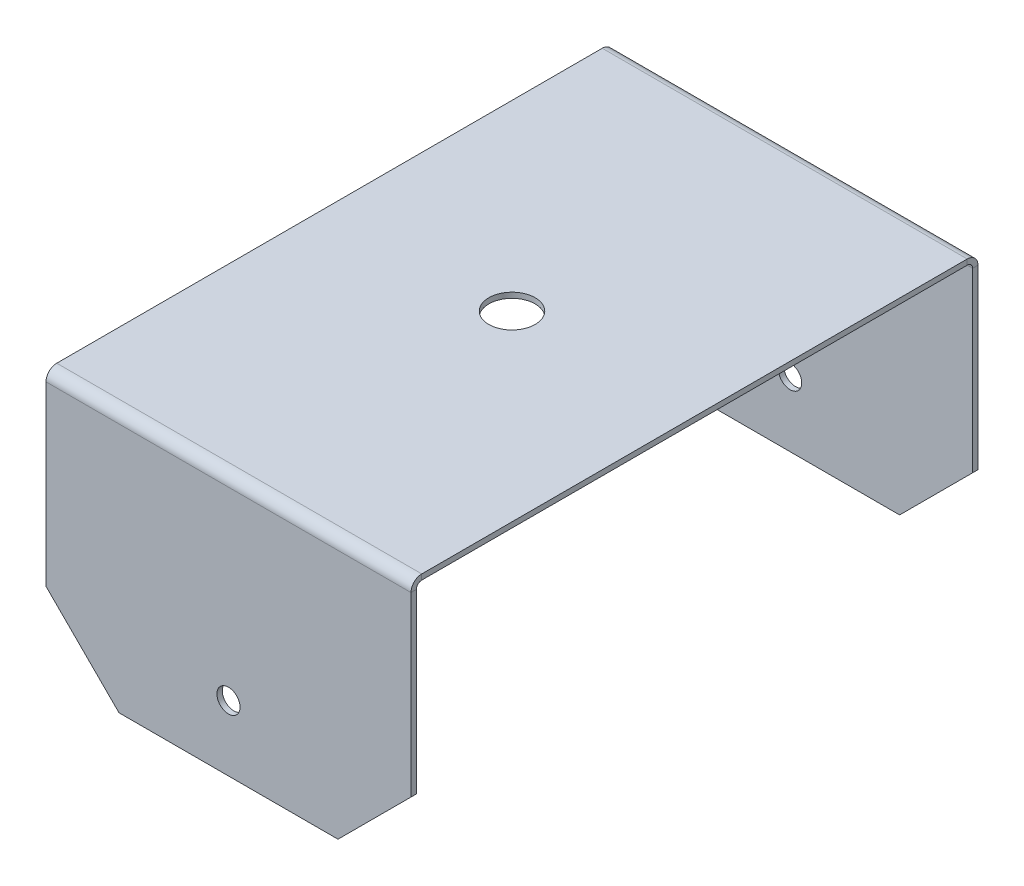
ISO-10303-21;
HEADER;
FILE_DESCRIPTION(('STEP AP214'),'2;1');
FILE_NAME('part.step','',(''),(''),'','','');
FILE_SCHEMA(('AUTOMOTIVE_DESIGN { 1 0 10303 214 1 1 1 1 }'));
ENDSEC;
DATA;
#1=APPLICATION_CONTEXT('core data for automotive mechanical design processes');
#2=APPLICATION_PROTOCOL_DEFINITION('international standard','automotive_design',2000,#1);
#3=PRODUCT_CONTEXT('',#1,'mechanical');
#4=PRODUCT('Part','Part','',(#3));
#5=PRODUCT_RELATED_PRODUCT_CATEGORY('part','',(#4));
#6=PRODUCT_DEFINITION_FORMATION('','',#4);
#7=PRODUCT_DEFINITION_CONTEXT('part definition',#1,'design');
#8=PRODUCT_DEFINITION('design','',#6,#7);
#9=PRODUCT_DEFINITION_SHAPE('','',#8);
#10=(LENGTH_UNIT() NAMED_UNIT(*) SI_UNIT(.MILLI.,.METRE.));
#11=(NAMED_UNIT(*) PLANE_ANGLE_UNIT() SI_UNIT($,.RADIAN.));
#12=(NAMED_UNIT(*) SI_UNIT($,.STERADIAN.) SOLID_ANGLE_UNIT());
#13=UNCERTAINTY_MEASURE_WITH_UNIT(LENGTH_MEASURE(1.E-05),#10,'distance_accuracy_value','');
#14=(GEOMETRIC_REPRESENTATION_CONTEXT(3) GLOBAL_UNCERTAINTY_ASSIGNED_CONTEXT((#13)) GLOBAL_UNIT_ASSIGNED_CONTEXT((#10,
#11,#12)) REPRESENTATION_CONTEXT('',''));
#15=CARTESIAN_POINT('',(0.,0.,0.));
#16=DIRECTION('',(0.,0.,1.));
#17=DIRECTION('',(1.,0.,0.));
#18=AXIS2_PLACEMENT_3D('',#15,#16,#17);
#19=CARTESIAN_POINT('',(25.,0.,-37.3634));
#20=DIRECTION('',(1.,0.,0.));
#21=DIRECTION('',(0.,0.,-1.));
#22=AXIS2_PLACEMENT_3D('',#19,#20,#21);
#23=PLANE('',#22);
#24=DIRECTION('',(0.,1.,0.));
#25=VECTOR('',#24,1.);
#26=CARTESIAN_POINT('',(25.,0.,-37.3634));
#27=LINE('',#26,#25);
#28=CARTESIAN_POINT('',(25.,0.,-37.3634));
#29=VERTEX_POINT('',#28);
#30=CARTESIAN_POINT('',(25.,0.736600000000004,-37.3634));
#31=VERTEX_POINT('',#30);
#32=EDGE_CURVE('E278',#29,#31,#27,.T.);
#33=ORIENTED_EDGE('',*,*,#32,.F.);
#34=CARTESIAN_POINT('',(25.,-0.736600000000004,-37.3634));
#35=DIRECTION('',(-1.,0.,0.));
#36=DIRECTION('',(0.,0.,1.));
#37=AXIS2_PLACEMENT_3D('',#34,#35,#36);
#38=CIRCLE('',#37,0.7366);
#39=CARTESIAN_POINT('',(25.,-0.736600000000004,-38.1));
#40=VERTEX_POINT('',#39);
#41=EDGE_CURVE('E223',#40,#29,#38,.F.);
#42=ORIENTED_EDGE('',*,*,#41,.F.);
#43=DIRECTION('',(0.,0.,1.));
#44=VECTOR('',#43,1.);
#45=CARTESIAN_POINT('',(25.,-0.736600000000004,-38.8366));
#46=LINE('',#45,#44);
#47=CARTESIAN_POINT('',(25.,-0.736600000000004,-38.8366));
#48=VERTEX_POINT('',#47);
#49=EDGE_CURVE('E275',#48,#40,#46,.T.);
#50=ORIENTED_EDGE('',*,*,#49,.F.);
#51=CARTESIAN_POINT('',(25.,-0.736600000000004,-37.3634));
#52=DIRECTION('',(1.,0.,0.));
#53=DIRECTION('',(0.,0.,-1.));
#54=AXIS2_PLACEMENT_3D('',#51,#52,#53);
#55=CIRCLE('',#54,1.4732);
#56=EDGE_CURVE('E230',#48,#31,#55,.T.);
#57=ORIENTED_EDGE('',*,*,#56,.T.);
#58=EDGE_LOOP('',(#33,#42,#50,#57));
#59=FACE_BOUND('',#58,.T.);
#60=ADVANCED_FACE('F40',(#59),#23,.T.);
#61=CARTESIAN_POINT('',(25.,-0.736600000000004,-38.8366));
#62=DIRECTION('',(1.,0.,0.));
#63=DIRECTION('',(0.,0.,-1.));
#64=AXIS2_PLACEMENT_3D('',#61,#62,#63);
#65=PLANE('',#64);
#66=DIRECTION('',(0.,0.,1.));
#67=VECTOR('',#66,1.);
#68=CARTESIAN_POINT('',(25.,0.,38.1));
#69=LINE('',#68,#67);
#70=CARTESIAN_POINT('',(25.,0.,37.3634));
#71=VERTEX_POINT('',#70);
#72=EDGE_CURVE('E220',#29,#71,#69,.T.);
#73=ORIENTED_EDGE('',*,*,#72,.F.);
#74=ORIENTED_EDGE('',*,*,#32,.T.);
#75=DIRECTION('',(0.,0.,1.));
#76=VECTOR('',#75,1.);
#77=CARTESIAN_POINT('',(25.,0.736600000000004,38.1));
#78=LINE('',#77,#76);
#79=CARTESIAN_POINT('',(25.,0.736600000000004,37.3634));
#80=VERTEX_POINT('',#79);
#81=EDGE_CURVE('E233',#31,#80,#78,.T.);
#82=ORIENTED_EDGE('',*,*,#81,.T.);
#83=DIRECTION('',(0.,-1.,0.));
#84=VECTOR('',#83,1.);
#85=CARTESIAN_POINT('',(25.,0.736600000000004,37.3634));
#86=LINE('',#85,#84);
#87=EDGE_CURVE('E266',#80,#71,#86,.T.);
#88=ORIENTED_EDGE('',*,*,#87,.T.);
#89=EDGE_LOOP('',(#73,#74,#82,#88));
#90=FACE_BOUND('',#89,.T.);
#91=ADVANCED_FACE('F362',(#90),#65,.T.);
#92=CARTESIAN_POINT('',(-25.,-0.736600000000011,-38.1));
#93=DIRECTION('',(-1.,0.,0.));
#94=DIRECTION('',(0.,0.,1.));
#95=AXIS2_PLACEMENT_3D('',#92,#93,#94);
#96=PLANE('',#95);
#97=DIRECTION('',(0.,0.,-1.));
#98=VECTOR('',#97,1.);
#99=CARTESIAN_POINT('',(-25.,-0.736600000000011,-38.1));
#100=LINE('',#99,#98);
#101=CARTESIAN_POINT('',(-25.,-0.736600000000011,-38.1));
#102=VERTEX_POINT('',#101);
#103=CARTESIAN_POINT('',(-25.,-0.736600000000007,-38.8366));
#104=VERTEX_POINT('',#103);
#105=EDGE_CURVE('E272',#102,#104,#100,.T.);
#106=ORIENTED_EDGE('',*,*,#105,.F.);
#107=CARTESIAN_POINT('',(-25.,-0.736600000000011,-37.3634));
#108=DIRECTION('',(-1.,0.,0.));
#109=DIRECTION('',(0.,0.,1.));
#110=AXIS2_PLACEMENT_3D('',#107,#108,#109);
#111=CIRCLE('',#110,0.7366);
#112=CARTESIAN_POINT('',(-25.,0.,-37.3634));
#113=VERTEX_POINT('',#112);
#114=EDGE_CURVE('E200',#102,#113,#111,.F.);
#115=ORIENTED_EDGE('',*,*,#114,.T.);
#116=DIRECTION('',(0.,-1.,0.));
#117=VECTOR('',#116,1.);
#118=CARTESIAN_POINT('',(-25.,0.736599999999983,-37.3634));
#119=LINE('',#118,#117);
#120=CARTESIAN_POINT('',(-25.,0.736599999999983,-37.3634));
#121=VERTEX_POINT('',#120);
#122=EDGE_CURVE('E270',#121,#113,#119,.T.);
#123=ORIENTED_EDGE('',*,*,#122,.F.);
#124=CARTESIAN_POINT('',(-25.,-0.736600000000011,-37.3634));
#125=DIRECTION('',(1.,0.,0.));
#126=DIRECTION('',(0.,0.,-1.));
#127=AXIS2_PLACEMENT_3D('',#124,#125,#126);
#128=CIRCLE('',#127,1.4732);
#129=EDGE_CURVE('E207',#104,#121,#128,.T.);
#130=ORIENTED_EDGE('',*,*,#129,.F.);
#131=EDGE_LOOP('',(#106,#115,#123,#130));
#132=FACE_BOUND('',#131,.T.);
#133=ADVANCED_FACE('F343',(#132),#96,.T.);
#134=CARTESIAN_POINT('',(-25.,0.736599999999983,-37.3634));
#135=DIRECTION('',(-1.,0.,0.));
#136=DIRECTION('',(0.,0.,1.));
#137=AXIS2_PLACEMENT_3D('',#134,#135,#136);
#138=PLANE('',#137);
#139=DIRECTION('',(0.,1.,0.));
#140=VECTOR('',#139,1.);
#141=CARTESIAN_POINT('',(-25.,0.,-38.8366));
#142=LINE('',#141,#140);
#143=CARTESIAN_POINT('',(-25.,-25.,-38.8366));
#144=VERTEX_POINT('',#143);
#145=EDGE_CURVE('E205',#144,#104,#142,.T.);
#146=ORIENTED_EDGE('',*,*,#145,.F.);
#147=DIRECTION('',(0.,0.,1.));
#148=VECTOR('',#147,1.);
#149=CARTESIAN_POINT('',(-25.,-25.,-37.3634));
#150=LINE('',#149,#148);
#151=CARTESIAN_POINT('',(-25.,-25.,-38.1));
#152=VERTEX_POINT('',#151);
#153=EDGE_CURVE('E280',#144,#152,#150,.T.);
#154=ORIENTED_EDGE('',*,*,#153,.T.);
#155=DIRECTION('',(0.,1.,0.));
#156=VECTOR('',#155,1.);
#157=CARTESIAN_POINT('',(-25.,0.,-38.1));
#158=LINE('',#157,#156);
#159=EDGE_CURVE('E203',#152,#102,#158,.T.);
#160=ORIENTED_EDGE('',*,*,#159,.T.);
#161=ORIENTED_EDGE('',*,*,#105,.T.);
#162=EDGE_LOOP('',(#146,#154,#160,#161));
#163=FACE_BOUND('',#162,.T.);
#164=ADVANCED_FACE('F336',(#163),#138,.T.);
#165=CARTESIAN_POINT('',(25.,-0.736600000000004,38.1));
#166=DIRECTION('',(1.,0.,0.));
#167=DIRECTION('',(0.,0.,-1.));
#168=AXIS2_PLACEMENT_3D('',#165,#166,#167);
#169=PLANE('',#168);
#170=DIRECTION('',(0.,0.,1.));
#171=VECTOR('',#170,1.);
#172=CARTESIAN_POINT('',(25.,-0.736600000000004,38.1));
#173=LINE('',#172,#171);
#174=CARTESIAN_POINT('',(25.,-0.736600000000004,38.1));
#175=VERTEX_POINT('',#174);
#176=CARTESIAN_POINT('',(25.,-0.736600000000004,38.8366));
#177=VERTEX_POINT('',#176);
#178=EDGE_CURVE('E268',#175,#177,#173,.T.);
#179=ORIENTED_EDGE('',*,*,#178,.F.);
#180=CARTESIAN_POINT('',(25.,-0.736600000000004,37.3634));
#181=DIRECTION('',(-1.,0.,0.));
#182=DIRECTION('',(0.,0.,1.));
#183=AXIS2_PLACEMENT_3D('',#180,#181,#182);
#184=CIRCLE('',#183,0.7366);
#185=EDGE_CURVE('E181',#71,#175,#184,.F.);
#186=ORIENTED_EDGE('',*,*,#185,.F.);
#187=ORIENTED_EDGE('',*,*,#87,.F.);
#188=CARTESIAN_POINT('',(25.,-0.736600000000004,37.3634));
#189=DIRECTION('',(1.,0.,0.));
#190=DIRECTION('',(0.,0.,-1.));
#191=AXIS2_PLACEMENT_3D('',#188,#189,#190);
#192=CIRCLE('',#191,1.4732);
#193=EDGE_CURVE('E236',#80,#177,#192,.T.);
#194=ORIENTED_EDGE('',*,*,#193,.T.);
#195=EDGE_LOOP('',(#179,#186,#187,#194));
#196=FACE_BOUND('',#195,.T.);
#197=ADVANCED_FACE('F359',(#196),#169,.T.);
#198=CARTESIAN_POINT('',(25.,0.736600000000004,37.3634));
#199=DIRECTION('',(1.,0.,0.));
#200=DIRECTION('',(0.,0.,-1.));
#201=AXIS2_PLACEMENT_3D('',#198,#199,#200);
#202=PLANE('',#201);
#203=DIRECTION('',(0.,-1.,0.));
#204=VECTOR('',#203,1.);
#205=CARTESIAN_POINT('',(25.,0.,38.8366));
#206=LINE('',#205,#204);
#207=CARTESIAN_POINT('',(25.,-25.,38.8366));
#208=VERTEX_POINT('',#207);
#209=EDGE_CURVE('E215',#177,#208,#206,.T.);
#210=ORIENTED_EDGE('',*,*,#209,.T.);
#211=DIRECTION('',(0.,0.,-1.));
#212=VECTOR('',#211,1.);
#213=CARTESIAN_POINT('',(25.,-25.,37.3634));
#214=LINE('',#213,#212);
#215=CARTESIAN_POINT('',(25.,-25.,38.1));
#216=VERTEX_POINT('',#215);
#217=EDGE_CURVE('E11',#208,#216,#214,.T.);
#218=ORIENTED_EDGE('',*,*,#217,.T.);
#219=DIRECTION('',(0.,-1.,0.));
#220=VECTOR('',#219,1.);
#221=CARTESIAN_POINT('',(25.,0.,38.1));
#222=LINE('',#221,#220);
#223=EDGE_CURVE('E217',#175,#216,#222,.T.);
#224=ORIENTED_EDGE('',*,*,#223,.F.);
#225=ORIENTED_EDGE('',*,*,#178,.T.);
#226=EDGE_LOOP('',(#210,#218,#224,#225));
#227=FACE_BOUND('',#226,.T.);
#228=ADVANCED_FACE('F408',(#227),#202,.T.);
#229=CARTESIAN_POINT('',(-25.,0.,37.3634));
#230=DIRECTION('',(-1.,0.,0.));
#231=DIRECTION('',(0.,0.,1.));
#232=AXIS2_PLACEMENT_3D('',#229,#230,#231);
#233=PLANE('',#232);
#234=DIRECTION('',(0.,1.,0.));
#235=VECTOR('',#234,1.);
#236=CARTESIAN_POINT('',(-25.,0.,37.3634));
#237=LINE('',#236,#235);
#238=CARTESIAN_POINT('',(-25.,0.,37.3634));
#239=VERTEX_POINT('',#238);
#240=CARTESIAN_POINT('',(-25.,0.736599999999987,37.3634));
#241=VERTEX_POINT('',#240);
#242=EDGE_CURVE('E169',#239,#241,#237,.T.);
#243=ORIENTED_EDGE('',*,*,#242,.F.);
#244=CARTESIAN_POINT('',(-25.,-0.736600000000007,37.3634));
#245=DIRECTION('',(-1.,0.,0.));
#246=DIRECTION('',(0.,0.,1.));
#247=AXIS2_PLACEMENT_3D('',#244,#245,#246);
#248=CIRCLE('',#247,0.7366);
#249=CARTESIAN_POINT('',(-25.,-0.736600000000011,38.1));
#250=VERTEX_POINT('',#249);
#251=EDGE_CURVE('E179',#239,#250,#248,.F.);
#252=ORIENTED_EDGE('',*,*,#251,.T.);
#253=DIRECTION('',(0.,0.,-1.));
#254=VECTOR('',#253,1.);
#255=CARTESIAN_POINT('',(-25.,-0.736600000000011,38.8366));
#256=LINE('',#255,#254);
#257=CARTESIAN_POINT('',(-25.,-0.736600000000011,38.8366));
#258=VERTEX_POINT('',#257);
#259=EDGE_CURVE('E155',#258,#250,#256,.T.);
#260=ORIENTED_EDGE('',*,*,#259,.F.);
#261=CARTESIAN_POINT('',(-25.,-0.736600000000007,37.3634));
#262=DIRECTION('',(1.,0.,0.));
#263=DIRECTION('',(0.,0.,-1.));
#264=AXIS2_PLACEMENT_3D('',#261,#262,#263);
#265=CIRCLE('',#264,1.4732);
#266=EDGE_CURVE('E213',#241,#258,#265,.T.);
#267=ORIENTED_EDGE('',*,*,#266,.F.);
#268=EDGE_LOOP('',(#243,#252,#260,#267));
#269=FACE_BOUND('',#268,.T.);
#270=ADVANCED_FACE('F186',(#269),#233,.T.);
#271=CARTESIAN_POINT('',(-25.,-0.736600000000011,38.8366));
#272=DIRECTION('',(-1.,0.,0.));
#273=DIRECTION('',(0.,0.,1.));
#274=AXIS2_PLACEMENT_3D('',#271,#272,#273);
#275=PLANE('',#274);
#276=DIRECTION('',(0.,0.,1.));
#277=VECTOR('',#276,1.);
#278=CARTESIAN_POINT('',(-25.,0.,38.1));
#279=LINE('',#278,#277);
#280=EDGE_CURVE('E188',#113,#239,#279,.T.);
#281=ORIENTED_EDGE('',*,*,#280,.T.);
#282=ORIENTED_EDGE('',*,*,#242,.T.);
#283=DIRECTION('',(0.,0.,1.));
#284=VECTOR('',#283,1.);
#285=CARTESIAN_POINT('',(-25.,0.736599999999983,38.1));
#286=LINE('',#285,#284);
#287=EDGE_CURVE('E210',#121,#241,#286,.T.);
#288=ORIENTED_EDGE('',*,*,#287,.F.);
#289=ORIENTED_EDGE('',*,*,#122,.T.);
#290=EDGE_LOOP('',(#281,#282,#288,#289));
#291=FACE_BOUND('',#290,.T.);
#292=ADVANCED_FACE('F352',(#291),#275,.T.);
#293=CARTESIAN_POINT('',(25.,0.,38.8366));
#294=DIRECTION('',(0.,0.,-1.));
#295=DIRECTION('',(0.,1.,0.));
#296=AXIS2_PLACEMENT_3D('',#293,#294,#295);
#297=PLANE('',#296);
#298=CARTESIAN_POINT('',(0.,-26.0533133898946,38.8366));
#299=DIRECTION('',(0.,0.,-1.));
#300=DIRECTION('',(0.,1.,0.));
#301=AXIS2_PLACEMENT_3D('',#298,#299,#300);
#302=CIRCLE('',#301,1.5875);
#303=CARTESIAN_POINT('',(0.,-24.4658133898946,38.8366));
#304=VERTEX_POINT('',#303);
#305=EDGE_CURVE('E683',#304,#304,#302,.T.);
#306=ORIENTED_EDGE('',*,*,#305,.T.);
#307=EDGE_LOOP('',(#306));
#308=FACE_BOUND('',#307,.T.);
#309=DIRECTION('',(0.,-1.,0.));
#310=VECTOR('',#309,1.);
#311=CARTESIAN_POINT('',(-25.,0.,38.8366));
#312=LINE('',#311,#310);
#313=CARTESIAN_POINT('',(-25.,-25.,38.8366));
#314=VERTEX_POINT('',#313);
#315=EDGE_CURVE('E163',#258,#314,#312,.T.);
#316=ORIENTED_EDGE('',*,*,#315,.T.);
#317=DIRECTION('',(-0.707106781186549,0.707106781186546,0.));
#318=VECTOR('',#317,1.);
#319=CARTESIAN_POINT('',(-25.,-25.,38.8366));
#320=LINE('',#319,#318);
#321=CARTESIAN_POINT('',(-14.9999999999999,-35.,38.8366));
#322=VERTEX_POINT('',#321);
#323=EDGE_CURVE('E300',#314,#322,#320,.F.);
#324=ORIENTED_EDGE('',*,*,#323,.T.);
#325=DIRECTION('',(-1.,0.,0.));
#326=VECTOR('',#325,1.);
#327=CARTESIAN_POINT('',(25.,-35.,38.8366));
#328=LINE('',#327,#326);
#329=CARTESIAN_POINT('',(15.,-35.,38.8366));
#330=VERTEX_POINT('',#329);
#331=EDGE_CURVE('E170',#330,#322,#328,.T.);
#332=ORIENTED_EDGE('',*,*,#331,.F.);
#333=DIRECTION('',(-0.707106781186546,-0.707106781186549,0.));
#334=VECTOR('',#333,1.);
#335=CARTESIAN_POINT('',(15.,-35.,38.8366));
#336=LINE('',#335,#334);
#337=EDGE_CURVE('E298',#330,#208,#336,.F.);
#338=ORIENTED_EDGE('',*,*,#337,.T.);
#339=ORIENTED_EDGE('',*,*,#209,.F.);
#340=DIRECTION('',(-1.,0.,0.));
#341=VECTOR('',#340,1.);
#342=CARTESIAN_POINT('',(25.,-0.736600000000004,38.8366));
#343=LINE('',#342,#341);
#344=EDGE_CURVE('E239',#177,#258,#343,.T.);
#345=ORIENTED_EDGE('',*,*,#344,.T.);
#346=EDGE_LOOP('',(#316,#324,#332,#338,#339,#345));
#347=FACE_BOUND('',#346,.T.);
#348=ADVANCED_FACE('F407',(#308,#347),#297,.F.);
#349=CARTESIAN_POINT('',(25.,-35.,38.1));
#350=DIRECTION('',(0.,-1.,0.));
#351=DIRECTION('',(0.,0.,-1.));
#352=AXIS2_PLACEMENT_3D('',#349,#350,#351);
#353=PLANE('',#352);
#354=ORIENTED_EDGE('',*,*,#331,.T.);
#355=DIRECTION('',(0.,0.,-1.));
#356=VECTOR('',#355,1.);
#357=CARTESIAN_POINT('',(-15.,-35.,38.1));
#358=LINE('',#357,#356);
#359=CARTESIAN_POINT('',(-15.,-35.,38.1));
#360=VERTEX_POINT('',#359);
#361=EDGE_CURVE('E61',#322,#360,#358,.T.);
#362=ORIENTED_EDGE('',*,*,#361,.T.);
#363=DIRECTION('',(-1.,0.,0.));
#364=VECTOR('',#363,1.);
#365=CARTESIAN_POINT('',(25.,-35.,38.1));
#366=LINE('',#365,#364);
#367=CARTESIAN_POINT('',(15.,-35.,38.1));
#368=VERTEX_POINT('',#367);
#369=EDGE_CURVE('E183',#368,#360,#366,.T.);
#370=ORIENTED_EDGE('',*,*,#369,.F.);
#371=DIRECTION('',(0.,0.,1.));
#372=VECTOR('',#371,1.);
#373=CARTESIAN_POINT('',(15.,-35.,38.1));
#374=LINE('',#373,#372);
#375=EDGE_CURVE('E302',#368,#330,#374,.T.);
#376=ORIENTED_EDGE('',*,*,#375,.T.);
#377=EDGE_LOOP('',(#354,#362,#370,#376));
#378=FACE_BOUND('',#377,.T.);
#379=ADVANCED_FACE('F404',(#378),#353,.T.);
#380=CARTESIAN_POINT('',(25.,0.,38.1));
#381=DIRECTION('',(0.,0.,-1.));
#382=DIRECTION('',(0.,1.,0.));
#383=AXIS2_PLACEMENT_3D('',#380,#381,#382);
#384=PLANE('',#383);
#385=CARTESIAN_POINT('',(0.,-26.0533133898946,38.1));
#386=DIRECTION('',(0.,0.,-1.));
#387=DIRECTION('',(0.,1.,0.));
#388=AXIS2_PLACEMENT_3D('',#385,#386,#387);
#389=CIRCLE('',#388,1.5875);
#390=CARTESIAN_POINT('',(0.,-24.4658133898946,38.1));
#391=VERTEX_POINT('',#390);
#392=EDGE_CURVE('E194',#391,#391,#389,.T.);
#393=ORIENTED_EDGE('',*,*,#392,.F.);
#394=EDGE_LOOP('',(#393));
#395=FACE_BOUND('',#394,.T.);
#396=ORIENTED_EDGE('',*,*,#369,.T.);
#397=DIRECTION('',(0.707106781186549,-0.707106781186546,0.));
#398=VECTOR('',#397,1.);
#399=CARTESIAN_POINT('',(-12.4999999999999,-37.5000000000001,38.1));
#400=LINE('',#399,#398);
#401=CARTESIAN_POINT('',(-25.,-25.,38.1));
#402=VERTEX_POINT('',#401);
#403=EDGE_CURVE('E192',#360,#402,#400,.F.);
#404=ORIENTED_EDGE('',*,*,#403,.T.);
#405=DIRECTION('',(0.,-1.,0.));
#406=VECTOR('',#405,1.);
#407=CARTESIAN_POINT('',(-25.,0.,38.1));
#408=LINE('',#407,#406);
#409=EDGE_CURVE('E160',#250,#402,#408,.T.);
#410=ORIENTED_EDGE('',*,*,#409,.F.);
#411=DIRECTION('',(-1.,0.,0.));
#412=VECTOR('',#411,1.);
#413=CARTESIAN_POINT('',(25.,-0.736600000000004,38.1));
#414=LINE('',#413,#412);
#415=EDGE_CURVE('E176',#175,#250,#414,.T.);
#416=ORIENTED_EDGE('',*,*,#415,.F.);
#417=ORIENTED_EDGE('',*,*,#223,.T.);
#418=DIRECTION('',(0.707106781186546,0.707106781186549,0.));
#419=VECTOR('',#418,1.);
#420=CARTESIAN_POINT('',(37.5,-12.4999999999999,38.1));
#421=LINE('',#420,#419);
#422=EDGE_CURVE('E306',#216,#368,#421,.F.);
#423=ORIENTED_EDGE('',*,*,#422,.T.);
#424=EDGE_LOOP('',(#396,#404,#410,#416,#417,#423));
#425=FACE_BOUND('',#424,.T.);
#426=ADVANCED_FACE('F190',(#395,#425),#384,.T.);
#427=CARTESIAN_POINT('',(25.,-0.736600000000004,37.3634));
#428=DIRECTION('',(-1.,0.,0.));
#429=DIRECTION('',(0.,0.,1.));
#430=AXIS2_PLACEMENT_3D('',#427,#428,#429);
#431=CYLINDRICAL_SURFACE('',#430,0.7366);
#432=ORIENTED_EDGE('',*,*,#415,.T.);
#433=ORIENTED_EDGE('',*,*,#251,.F.);
#434=DIRECTION('',(-1.,0.,0.));
#435=VECTOR('',#434,1.);
#436=CARTESIAN_POINT('',(25.,0.,37.3634));
#437=LINE('',#436,#435);
#438=EDGE_CURVE('E184',#71,#239,#437,.T.);
#439=ORIENTED_EDGE('',*,*,#438,.F.);
#440=ORIENTED_EDGE('',*,*,#185,.T.);
#441=EDGE_LOOP('',(#432,#433,#439,#440));
#442=FACE_BOUND('',#441,.T.);
#443=ADVANCED_FACE('F177',(#442),#431,.F.);
#444=CARTESIAN_POINT('',(25.,0.,38.1));
#445=DIRECTION('',(0.,-1.,0.));
#446=DIRECTION('',(0.,0.,-1.));
#447=AXIS2_PLACEMENT_3D('',#444,#445,#446);
#448=PLANE('',#447);
#449=CARTESIAN_POINT('',(0.,0.,0.));
#450=DIRECTION('',(0.,-1.,0.));
#451=DIRECTION('',(0.,0.,-1.));
#452=AXIS2_PLACEMENT_3D('',#449,#450,#451);
#453=CIRCLE('',#452,3.175);
#454=CARTESIAN_POINT('',(0.,0.,-3.17499999999999));
#455=VERTEX_POINT('',#454);
#456=EDGE_CURVE('E675',#455,#455,#453,.T.);
#457=ORIENTED_EDGE('',*,*,#456,.F.);
#458=EDGE_LOOP('',(#457));
#459=FACE_BOUND('',#458,.T.);
#460=ORIENTED_EDGE('',*,*,#438,.T.);
#461=ORIENTED_EDGE('',*,*,#280,.F.);
#462=DIRECTION('',(-1.,0.,0.));
#463=VECTOR('',#462,1.);
#464=CARTESIAN_POINT('',(25.,0.,-37.3634));
#465=LINE('',#464,#463);
#466=EDGE_CURVE('E259',#29,#113,#465,.T.);
#467=ORIENTED_EDGE('',*,*,#466,.F.);
#468=ORIENTED_EDGE('',*,*,#72,.T.);
#469=EDGE_LOOP('',(#460,#461,#467,#468));
#470=FACE_BOUND('',#469,.T.);
#471=ADVANCED_FACE('F370',(#459,#470),#448,.T.);
#472=CARTESIAN_POINT('',(25.,-0.736600000000004,-37.3634));
#473=DIRECTION('',(-1.,0.,0.));
#474=DIRECTION('',(0.,0.,1.));
#475=AXIS2_PLACEMENT_3D('',#472,#473,#474);
#476=CYLINDRICAL_SURFACE('',#475,0.7366);
#477=ORIENTED_EDGE('',*,*,#466,.T.);
#478=ORIENTED_EDGE('',*,*,#114,.F.);
#479=DIRECTION('',(-1.,0.,0.));
#480=VECTOR('',#479,1.);
#481=CARTESIAN_POINT('',(25.,-0.736600000000004,-38.1));
#482=LINE('',#481,#480);
#483=EDGE_CURVE('E256',#40,#102,#482,.T.);
#484=ORIENTED_EDGE('',*,*,#483,.F.);
#485=ORIENTED_EDGE('',*,*,#41,.T.);
#486=EDGE_LOOP('',(#477,#478,#484,#485));
#487=FACE_BOUND('',#486,.T.);
#488=ADVANCED_FACE('F368',(#487),#476,.F.);
#489=CARTESIAN_POINT('',(25.,0.,-38.1));
#490=DIRECTION('',(0.,0.,1.));
#491=DIRECTION('',(0.,-1.,0.));
#492=AXIS2_PLACEMENT_3D('',#489,#490,#491);
#493=PLANE('',#492);
#494=CARTESIAN_POINT('',(0.,-26.0533133898946,-38.1));
#495=DIRECTION('',(0.,0.,1.));
#496=DIRECTION('',(0.,-1.,0.));
#497=AXIS2_PLACEMENT_3D('',#494,#495,#496);
#498=CIRCLE('',#497,1.5875);
#499=CARTESIAN_POINT('',(0.,-27.6408133898946,-38.1));
#500=VERTEX_POINT('',#499);
#501=EDGE_CURVE('E686',#500,#500,#498,.T.);
#502=ORIENTED_EDGE('',*,*,#501,.F.);
#503=EDGE_LOOP('',(#502));
#504=FACE_BOUND('',#503,.T.);
#505=ORIENTED_EDGE('',*,*,#159,.F.);
#506=DIRECTION('',(-0.707106781186549,0.707106781186546,0.));
#507=VECTOR('',#506,1.);
#508=CARTESIAN_POINT('',(-12.4999999999999,-37.5,-38.1));
#509=LINE('',#508,#507);
#510=CARTESIAN_POINT('',(-14.9999999999999,-35.,-38.1));
#511=VERTEX_POINT('',#510);
#512=EDGE_CURVE('E285',#152,#511,#509,.F.);
#513=ORIENTED_EDGE('',*,*,#512,.T.);
#514=DIRECTION('',(-1.,0.,0.));
#515=VECTOR('',#514,1.);
#516=CARTESIAN_POINT('',(25.,-35.,-38.1));
#517=LINE('',#516,#515);
#518=CARTESIAN_POINT('',(15.,-35.,-38.1));
#519=VERTEX_POINT('',#518);
#520=EDGE_CURVE('E253',#519,#511,#517,.T.);
#521=ORIENTED_EDGE('',*,*,#520,.F.);
#522=DIRECTION('',(0.707106781186546,0.707106781186549,0.));
#523=VECTOR('',#522,1.);
#524=CARTESIAN_POINT('',(37.5,-12.4999999999999,-38.1));
#525=LINE('',#524,#523);
#526=CARTESIAN_POINT('',(25.,-25.,-38.1));
#527=VERTEX_POINT('',#526);
#528=EDGE_CURVE('E283',#519,#527,#525,.T.);
#529=ORIENTED_EDGE('',*,*,#528,.T.);
#530=DIRECTION('',(0.,1.,0.));
#531=VECTOR('',#530,1.);
#532=CARTESIAN_POINT('',(25.,0.,-38.1));
#533=LINE('',#532,#531);
#534=EDGE_CURVE('E226',#527,#40,#533,.T.);
#535=ORIENTED_EDGE('',*,*,#534,.T.);
#536=ORIENTED_EDGE('',*,*,#483,.T.);
#537=EDGE_LOOP('',(#505,#513,#521,#529,#535,#536));
#538=FACE_BOUND('',#537,.T.);
#539=ADVANCED_FACE('F329',(#504,#538),#493,.T.);
#540=CARTESIAN_POINT('',(25.,-35.,-38.8366));
#541=DIRECTION('',(0.,-1.,0.));
#542=DIRECTION('',(0.,0.,-1.));
#543=AXIS2_PLACEMENT_3D('',#540,#541,#542);
#544=PLANE('',#543);
#545=ORIENTED_EDGE('',*,*,#520,.T.);
#546=DIRECTION('',(0.,0.,-1.));
#547=VECTOR('',#546,1.);
#548=CARTESIAN_POINT('',(-14.9999999999999,-35.,-38.8366));
#549=LINE('',#548,#547);
#550=CARTESIAN_POINT('',(-14.9999999999999,-35.,-38.8366));
#551=VERTEX_POINT('',#550);
#552=EDGE_CURVE('E290',#511,#551,#549,.T.);
#553=ORIENTED_EDGE('',*,*,#552,.T.);
#554=DIRECTION('',(-1.,0.,0.));
#555=VECTOR('',#554,1.);
#556=CARTESIAN_POINT('',(25.,-35.,-38.8366));
#557=LINE('',#556,#555);
#558=CARTESIAN_POINT('',(15.,-35.,-38.8366));
#559=VERTEX_POINT('',#558);
#560=EDGE_CURVE('E250',#559,#551,#557,.T.);
#561=ORIENTED_EDGE('',*,*,#560,.F.);
#562=DIRECTION('',(0.,0.,1.));
#563=VECTOR('',#562,1.);
#564=CARTESIAN_POINT('',(15.,-35.,-38.1));
#565=LINE('',#564,#563);
#566=EDGE_CURVE('E287',#559,#519,#565,.T.);
#567=ORIENTED_EDGE('',*,*,#566,.T.);
#568=EDGE_LOOP('',(#545,#553,#561,#567));
#569=FACE_BOUND('',#568,.T.);
#570=ADVANCED_FACE('F325',(#569),#544,.T.);
#571=CARTESIAN_POINT('',(25.,0.,-38.8366));
#572=DIRECTION('',(0.,0.,1.));
#573=DIRECTION('',(0.,-1.,0.));
#574=AXIS2_PLACEMENT_3D('',#571,#572,#573);
#575=PLANE('',#574);
#576=CARTESIAN_POINT('',(0.,-26.0533133898946,-38.8366));
#577=DIRECTION('',(0.,0.,-1.));
#578=DIRECTION('',(0.,1.,0.));
#579=AXIS2_PLACEMENT_3D('',#576,#577,#578);
#580=CIRCLE('',#579,1.5875);
#581=CARTESIAN_POINT('',(0.,-24.4658133898946,-38.8366));
#582=VERTEX_POINT('',#581);
#583=EDGE_CURVE('E680',#582,#582,#580,.T.);
#584=ORIENTED_EDGE('',*,*,#583,.F.);
#585=EDGE_LOOP('',(#584));
#586=FACE_BOUND('',#585,.T.);
#587=ORIENTED_EDGE('',*,*,#560,.T.);
#588=DIRECTION('',(0.707106781186549,-0.707106781186546,0.));
#589=VECTOR('',#588,1.);
#590=CARTESIAN_POINT('',(-25.,-25.,-38.8366));
#591=LINE('',#590,#589);
#592=EDGE_CURVE('E294',#551,#144,#591,.F.);
#593=ORIENTED_EDGE('',*,*,#592,.T.);
#594=ORIENTED_EDGE('',*,*,#145,.T.);
#595=DIRECTION('',(-1.,0.,0.));
#596=VECTOR('',#595,1.);
#597=CARTESIAN_POINT('',(25.,-0.736600000000004,-38.8366));
#598=LINE('',#597,#596);
#599=EDGE_CURVE('E247',#48,#104,#598,.T.);
#600=ORIENTED_EDGE('',*,*,#599,.F.);
#601=DIRECTION('',(0.,1.,0.));
#602=VECTOR('',#601,1.);
#603=CARTESIAN_POINT('',(25.,0.,-38.8366));
#604=LINE('',#603,#602);
#605=CARTESIAN_POINT('',(25.,-25.,-38.8366));
#606=VERTEX_POINT('',#605);
#607=EDGE_CURVE('E228',#606,#48,#604,.T.);
#608=ORIENTED_EDGE('',*,*,#607,.F.);
#609=DIRECTION('',(-0.707106781186546,-0.707106781186549,0.));
#610=VECTOR('',#609,1.);
#611=CARTESIAN_POINT('',(15.,-35.,-38.8366));
#612=LINE('',#611,#610);
#613=EDGE_CURVE('E292',#606,#559,#612,.T.);
#614=ORIENTED_EDGE('',*,*,#613,.T.);
#615=EDGE_LOOP('',(#587,#593,#594,#600,#608,#614));
#616=FACE_BOUND('',#615,.T.);
#617=ADVANCED_FACE('F318',(#586,#616),#575,.F.);
#618=CARTESIAN_POINT('',(25.,-0.736600000000004,-37.3634));
#619=DIRECTION('',(-1.,0.,0.));
#620=DIRECTION('',(0.,0.,1.));
#621=AXIS2_PLACEMENT_3D('',#618,#619,#620);
#622=CYLINDRICAL_SURFACE('',#621,1.4732);
#623=ORIENTED_EDGE('',*,*,#599,.T.);
#624=ORIENTED_EDGE('',*,*,#129,.T.);
#625=DIRECTION('',(-1.,0.,0.));
#626=VECTOR('',#625,1.);
#627=CARTESIAN_POINT('',(25.,0.736600000000004,-37.3634));
#628=LINE('',#627,#626);
#629=EDGE_CURVE('E244',#31,#121,#628,.T.);
#630=ORIENTED_EDGE('',*,*,#629,.F.);
#631=ORIENTED_EDGE('',*,*,#56,.F.);
#632=EDGE_LOOP('',(#623,#624,#630,#631));
#633=FACE_BOUND('',#632,.T.);
#634=ADVANCED_FACE('F341',(#633),#622,.T.);
#635=CARTESIAN_POINT('',(25.,0.736600000000004,38.1));
#636=DIRECTION('',(0.,-1.,0.));
#637=DIRECTION('',(0.,0.,-1.));
#638=AXIS2_PLACEMENT_3D('',#635,#636,#637);
#639=PLANE('',#638);
#640=CARTESIAN_POINT('',(0.,0.736600000000004,0.));
#641=DIRECTION('',(0.,1.,0.));
#642=DIRECTION('',(0.,0.,1.));
#643=AXIS2_PLACEMENT_3D('',#640,#641,#642);
#644=CIRCLE('',#643,3.175);
#645=CARTESIAN_POINT('',(0.,0.736600000000004,3.17500000000001));
#646=VERTEX_POINT('',#645);
#647=EDGE_CURVE('E678',#646,#646,#644,.T.);
#648=ORIENTED_EDGE('',*,*,#647,.F.);
#649=EDGE_LOOP('',(#648));
#650=FACE_BOUND('',#649,.T.);
#651=ORIENTED_EDGE('',*,*,#629,.T.);
#652=ORIENTED_EDGE('',*,*,#287,.T.);
#653=DIRECTION('',(-1.,0.,0.));
#654=VECTOR('',#653,1.);
#655=CARTESIAN_POINT('',(25.,0.736600000000004,37.3634));
#656=LINE('',#655,#654);
#657=EDGE_CURVE('E241',#80,#241,#656,.T.);
#658=ORIENTED_EDGE('',*,*,#657,.F.);
#659=ORIENTED_EDGE('',*,*,#81,.F.);
#660=EDGE_LOOP('',(#651,#652,#658,#659));
#661=FACE_BOUND('',#660,.T.);
#662=ADVANCED_FACE('F350',(#650,#661),#639,.F.);
#663=CARTESIAN_POINT('',(25.,-0.736600000000004,37.3634));
#664=DIRECTION('',(-1.,0.,0.));
#665=DIRECTION('',(0.,0.,1.));
#666=AXIS2_PLACEMENT_3D('',#663,#664,#665);
#667=CYLINDRICAL_SURFACE('',#666,1.4732);
#668=ORIENTED_EDGE('',*,*,#657,.T.);
#669=ORIENTED_EDGE('',*,*,#266,.T.);
#670=ORIENTED_EDGE('',*,*,#344,.F.);
#671=ORIENTED_EDGE('',*,*,#193,.F.);
#672=EDGE_LOOP('',(#668,#669,#670,#671));
#673=FACE_BOUND('',#672,.T.);
#674=ADVANCED_FACE('F355',(#673),#667,.T.);
#675=CARTESIAN_POINT('',(25.,-0.736600000000004,37.3634));
#676=DIRECTION('',(-1.,0.,0.));
#677=DIRECTION('',(0.,0.,1.));
#678=AXIS2_PLACEMENT_3D('',#675,#676,#677);
#679=PLANE('',#678);
#680=ORIENTED_EDGE('',*,*,#534,.F.);
#681=DIRECTION('',(0.,0.,-1.));
#682=VECTOR('',#681,1.);
#683=CARTESIAN_POINT('',(25.,-25.,-38.8366));
#684=LINE('',#683,#682);
#685=EDGE_CURVE('E48',#527,#606,#684,.T.);
#686=ORIENTED_EDGE('',*,*,#685,.T.);
#687=ORIENTED_EDGE('',*,*,#607,.T.);
#688=ORIENTED_EDGE('',*,*,#49,.T.);
#689=EDGE_LOOP('',(#680,#686,#687,#688));
#690=FACE_BOUND('',#689,.T.);
#691=ADVANCED_FACE('F312',(#690),#679,.F.);
#692=CARTESIAN_POINT('',(-25.,-0.736600000000007,37.3634));
#693=DIRECTION('',(-1.,0.,0.));
#694=DIRECTION('',(0.,0.,1.));
#695=AXIS2_PLACEMENT_3D('',#692,#693,#694);
#696=PLANE('',#695);
#697=ORIENTED_EDGE('',*,*,#409,.T.);
#698=DIRECTION('',(0.,0.,1.));
#699=VECTOR('',#698,1.);
#700=CARTESIAN_POINT('',(-25.,-25.,37.3634));
#701=LINE('',#700,#699);
#702=EDGE_CURVE('E296',#402,#314,#701,.T.);
#703=ORIENTED_EDGE('',*,*,#702,.T.);
#704=ORIENTED_EDGE('',*,*,#315,.F.);
#705=ORIENTED_EDGE('',*,*,#259,.T.);
#706=EDGE_LOOP('',(#697,#703,#704,#705));
#707=FACE_BOUND('',#706,.T.);
#708=ADVANCED_FACE('F157',(#707),#696,.T.);
#709=CARTESIAN_POINT('',(0.,-26.0533133898946,38.8366));
#710=DIRECTION('',(0.,0.,-1.));
#711=DIRECTION('',(0.,1.,0.));
#712=AXIS2_PLACEMENT_3D('',#709,#710,#711);
#713=CYLINDRICAL_SURFACE('',#712,1.5875);
#714=ORIENTED_EDGE('',*,*,#501,.T.);
#715=EDGE_LOOP('',(#714));
#716=FACE_BOUND('',#715,.T.);
#717=ORIENTED_EDGE('',*,*,#583,.T.);
#718=EDGE_LOOP('',(#717));
#719=FACE_BOUND('',#718,.T.);
#720=ADVANCED_FACE('F577',(#716,#719),#713,.F.);
#721=ORIENTED_EDGE('',*,*,#392,.T.);
#722=EDGE_LOOP('',(#721));
#723=FACE_BOUND('',#722,.T.);
#724=ORIENTED_EDGE('',*,*,#305,.F.);
#725=EDGE_LOOP('',(#724));
#726=FACE_BOUND('',#725,.T.);
#727=ADVANCED_FACE('F587',(#723,#726),#713,.F.);
#728=CARTESIAN_POINT('',(0.,-9.26339999999999,0.));
#729=DIRECTION('',(0.,1.,0.));
#730=DIRECTION('',(0.,0.,1.));
#731=AXIS2_PLACEMENT_3D('',#728,#729,#730);
#732=CYLINDRICAL_SURFACE('',#731,3.175);
#733=ORIENTED_EDGE('',*,*,#456,.T.);
#734=EDGE_LOOP('',(#733));
#735=FACE_BOUND('',#734,.T.);
#736=ORIENTED_EDGE('',*,*,#647,.T.);
#737=EDGE_LOOP('',(#736));
#738=FACE_BOUND('',#737,.T.);
#739=ADVANCED_FACE('F392',(#735,#738),#732,.F.);
#740=CARTESIAN_POINT('',(-25.,-25.,-37.3634));
#741=DIRECTION('',(0.707106781186546,0.707106781186549,0.));
#742=DIRECTION('',(0.,0.,1.));
#743=AXIS2_PLACEMENT_3D('',#740,#741,#742);
#744=PLANE('',#743);
#745=ORIENTED_EDGE('',*,*,#592,.F.);
#746=ORIENTED_EDGE('',*,*,#552,.F.);
#747=ORIENTED_EDGE('',*,*,#512,.F.);
#748=ORIENTED_EDGE('',*,*,#153,.F.);
#749=EDGE_LOOP('',(#745,#746,#747,#748));
#750=FACE_BOUND('',#749,.T.);
#751=ADVANCED_FACE('F333',(#750),#744,.F.);
#752=CARTESIAN_POINT('',(-25.,-25.,37.3634));
#753=DIRECTION('',(0.707106781186546,0.707106781186549,0.));
#754=DIRECTION('',(0.,0.,1.));
#755=AXIS2_PLACEMENT_3D('',#752,#753,#754);
#756=PLANE('',#755);
#757=ORIENTED_EDGE('',*,*,#403,.F.);
#758=ORIENTED_EDGE('',*,*,#361,.F.);
#759=ORIENTED_EDGE('',*,*,#323,.F.);
#760=ORIENTED_EDGE('',*,*,#702,.F.);
#761=EDGE_LOOP('',(#757,#758,#759,#760));
#762=FACE_BOUND('',#761,.T.);
#763=ADVANCED_FACE('F391',(#762),#756,.F.);
#764=CARTESIAN_POINT('',(15.,-35.,-38.8366));
#765=DIRECTION('',(0.707106781186549,-0.707106781186546,0.));
#766=DIRECTION('',(0.,0.,-1.));
#767=AXIS2_PLACEMENT_3D('',#764,#765,#766);
#768=PLANE('',#767);
#769=ORIENTED_EDGE('',*,*,#613,.F.);
#770=ORIENTED_EDGE('',*,*,#685,.F.);
#771=ORIENTED_EDGE('',*,*,#528,.F.);
#772=ORIENTED_EDGE('',*,*,#566,.F.);
#773=EDGE_LOOP('',(#769,#770,#771,#772));
#774=FACE_BOUND('',#773,.T.);
#775=ADVANCED_FACE('F322',(#774),#768,.T.);
#776=CARTESIAN_POINT('',(15.,-35.,38.1));
#777=DIRECTION('',(-0.707106781186549,0.707106781186546,0.));
#778=DIRECTION('',(0.,0.,1.));
#779=AXIS2_PLACEMENT_3D('',#776,#777,#778);
#780=PLANE('',#779);
#781=ORIENTED_EDGE('',*,*,#422,.F.);
#782=ORIENTED_EDGE('',*,*,#217,.F.);
#783=ORIENTED_EDGE('',*,*,#337,.F.);
#784=ORIENTED_EDGE('',*,*,#375,.F.);
#785=EDGE_LOOP('',(#781,#782,#783,#784));
#786=FACE_BOUND('',#785,.T.);
#787=ADVANCED_FACE('F42',(#786),#780,.F.);
#788=CLOSED_SHELL('',(#60,#91,#133,#164,#197,#228,#270,#292,#348,#379,#426,#443,#471,#488,#539,
#570,#617,#634,#662,#674,#691,#708,#720,#727,#739,#751,#763,#775,#787));
#789=MANIFOLD_SOLID_BREP('B2',#788);
#790=ADVANCED_BREP_SHAPE_REPRESENTATION('',(#18,#789),#14);
#791=SHAPE_DEFINITION_REPRESENTATION(#9,#790);
ENDSEC;
END-ISO-10303-21;
